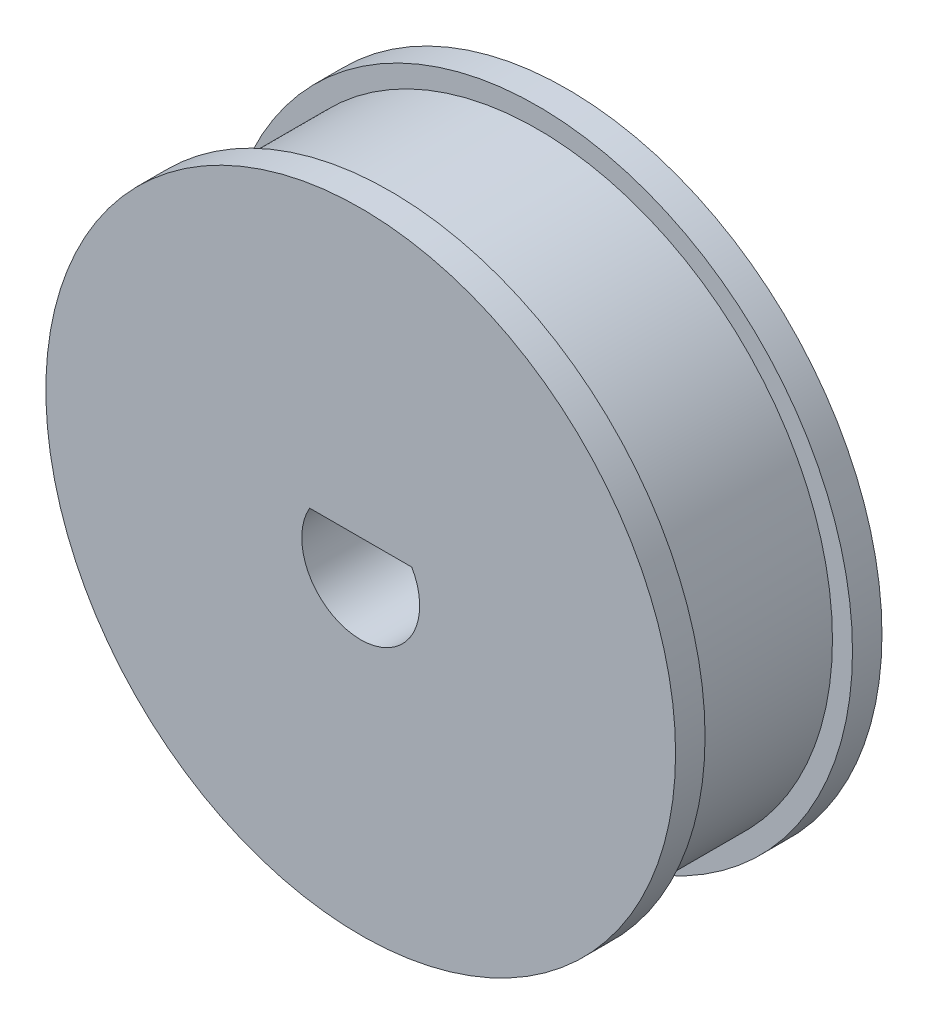
ISO-10303-21;
HEADER;
FILE_DESCRIPTION(('STEP AP214'),'2;1');
FILE_NAME('part.step','',(''),(''),'','','');
FILE_SCHEMA(('AUTOMOTIVE_DESIGN { 1 0 10303 214 1 1 1 1 }'));
ENDSEC;
DATA;
#1=APPLICATION_CONTEXT('core data for automotive mechanical design processes');
#2=APPLICATION_PROTOCOL_DEFINITION('international standard','automotive_design',2000,#1);
#3=PRODUCT_CONTEXT('',#1,'mechanical');
#4=PRODUCT('Part','Part','',(#3));
#5=PRODUCT_RELATED_PRODUCT_CATEGORY('part','',(#4));
#6=PRODUCT_DEFINITION_FORMATION('','',#4);
#7=PRODUCT_DEFINITION_CONTEXT('part definition',#1,'design');
#8=PRODUCT_DEFINITION('design','',#6,#7);
#9=PRODUCT_DEFINITION_SHAPE('','',#8);
#10=(LENGTH_UNIT() NAMED_UNIT(*) SI_UNIT(.MILLI.,.METRE.));
#11=(NAMED_UNIT(*) PLANE_ANGLE_UNIT() SI_UNIT($,.RADIAN.));
#12=(NAMED_UNIT(*) SI_UNIT($,.STERADIAN.) SOLID_ANGLE_UNIT());
#13=UNCERTAINTY_MEASURE_WITH_UNIT(LENGTH_MEASURE(1.E-05),#10,'distance_accuracy_value','');
#14=(GEOMETRIC_REPRESENTATION_CONTEXT(3) GLOBAL_UNCERTAINTY_ASSIGNED_CONTEXT((#13)) GLOBAL_UNIT_ASSIGNED_CONTEXT((#10,
#11,#12)) REPRESENTATION_CONTEXT('',''));
#15=CARTESIAN_POINT('',(0.,0.,0.));
#16=DIRECTION('',(0.,0.,1.));
#17=DIRECTION('',(1.,0.,0.));
#18=AXIS2_PLACEMENT_3D('',#15,#16,#17);
#19=CARTESIAN_POINT('',(0.,0.,7.));
#20=DIRECTION('',(0.,0.,-1.));
#21=DIRECTION('',(-1.,0.,0.));
#22=AXIS2_PLACEMENT_3D('',#19,#20,#21);
#23=CYLINDRICAL_SURFACE('',#22,10.6792057693911);
#24=CARTESIAN_POINT('',(0.,0.,0.));
#25=DIRECTION('',(0.,0.,1.));
#26=DIRECTION('',(1.,0.,0.));
#27=AXIS2_PLACEMENT_3D('',#24,#25,#26);
#28=CIRCLE('',#27,10.6792057693911);
#29=CARTESIAN_POINT('',(10.6792057693911,0.,0.));
#30=VERTEX_POINT('',#29);
#31=EDGE_CURVE('E43',#30,#30,#28,.T.);
#32=ORIENTED_EDGE('',*,*,#31,.T.);
#33=EDGE_LOOP('',(#32));
#34=FACE_BOUND('',#33,.T.);
#35=CARTESIAN_POINT('',(0.,0.,1.));
#36=DIRECTION('',(0.,0.,1.));
#37=DIRECTION('',(1.,0.,0.));
#38=AXIS2_PLACEMENT_3D('',#35,#36,#37);
#39=CIRCLE('',#38,10.6792057693911);
#40=CARTESIAN_POINT('',(10.6792057693911,0.,1.));
#41=VERTEX_POINT('',#40);
#42=EDGE_CURVE('E82',#41,#41,#39,.T.);
#43=ORIENTED_EDGE('',*,*,#42,.F.);
#44=EDGE_LOOP('',(#43));
#45=FACE_BOUND('',#44,.T.);
#46=ADVANCED_FACE('F39',(#34,#45),#23,.T.);
#47=CARTESIAN_POINT('',(0.,0.,7.));
#48=DIRECTION('',(0.,0.,1.));
#49=DIRECTION('',(1.,0.,0.));
#50=AXIS2_PLACEMENT_3D('',#47,#48,#49);
#51=PLANE('',#50);
#52=CARTESIAN_POINT('',(0.,0.,7.));
#53=DIRECTION('',(0.,0.,1.));
#54=DIRECTION('',(1.,0.,0.));
#55=AXIS2_PLACEMENT_3D('',#52,#53,#54);
#56=CIRCLE('',#55,10.6792057693911);
#57=CARTESIAN_POINT('',(10.6792057693911,0.,7.));
#58=VERTEX_POINT('',#57);
#59=EDGE_CURVE('E11',#58,#58,#56,.T.);
#60=ORIENTED_EDGE('',*,*,#59,.T.);
#61=EDGE_LOOP('',(#60));
#62=FACE_BOUND('',#61,.T.);
#63=DIRECTION('',(-1.,0.,0.));
#64=VECTOR('',#63,1.);
#65=CARTESIAN_POINT('',(-1.73205080756888,1.,7.));
#66=LINE('',#65,#64);
#67=CARTESIAN_POINT('',(1.73205080756888,1.,7.));
#68=VERTEX_POINT('',#67);
#69=CARTESIAN_POINT('',(-1.73205080756888,1.,7.));
#70=VERTEX_POINT('',#69);
#71=EDGE_CURVE('E89',#68,#70,#66,.T.);
#72=ORIENTED_EDGE('',*,*,#71,.F.);
#73=CARTESIAN_POINT('',(0.,0.,7.));
#74=DIRECTION('',(0.,0.,1.));
#75=DIRECTION('',(1.,0.,0.));
#76=AXIS2_PLACEMENT_3D('',#73,#74,#75);
#77=CIRCLE('',#76,2.);
#78=EDGE_CURVE('E73',#70,#68,#77,.T.);
#79=ORIENTED_EDGE('',*,*,#78,.F.);
#80=EDGE_LOOP('',(#72,#79));
#81=FACE_BOUND('',#80,.T.);
#82=ADVANCED_FACE('F119',(#62,#81),#51,.T.);
#83=CARTESIAN_POINT('',(0.,0.,0.));
#84=DIRECTION('',(0.,0.,1.));
#85=DIRECTION('',(1.,0.,0.));
#86=AXIS2_PLACEMENT_3D('',#83,#84,#85);
#87=PLANE('',#86);
#88=ORIENTED_EDGE('',*,*,#31,.F.);
#89=EDGE_LOOP('',(#88));
#90=FACE_BOUND('',#89,.T.);
#91=CARTESIAN_POINT('',(0.,0.,0.));
#92=DIRECTION('',(0.,0.,1.));
#93=DIRECTION('',(1.,0.,0.));
#94=AXIS2_PLACEMENT_3D('',#91,#92,#93);
#95=CIRCLE('',#94,2.);
#96=CARTESIAN_POINT('',(-1.73205080756888,1.,0.));
#97=VERTEX_POINT('',#96);
#98=CARTESIAN_POINT('',(1.73205080756888,1.,0.));
#99=VERTEX_POINT('',#98);
#100=EDGE_CURVE('E62',#97,#99,#95,.T.);
#101=ORIENTED_EDGE('',*,*,#100,.T.);
#102=DIRECTION('',(-1.,0.,0.));
#103=VECTOR('',#102,1.);
#104=CARTESIAN_POINT('',(-1.73205080756888,1.,0.));
#105=LINE('',#104,#103);
#106=EDGE_CURVE('E68',#99,#97,#105,.T.);
#107=ORIENTED_EDGE('',*,*,#106,.T.);
#108=EDGE_LOOP('',(#101,#107));
#109=FACE_BOUND('',#108,.T.);
#110=ADVANCED_FACE('F80',(#90,#109),#87,.F.);
#111=CARTESIAN_POINT('',(0.,0.,6.));
#112=DIRECTION('',(0.,0.,1.));
#113=DIRECTION('',(1.,0.,0.));
#114=AXIS2_PLACEMENT_3D('',#111,#112,#113);
#115=CIRCLE('',#114,10.6792057693911);
#116=CARTESIAN_POINT('',(10.6792057693911,0.,6.));
#117=VERTEX_POINT('',#116);
#118=EDGE_CURVE('E86',#117,#117,#115,.T.);
#119=ORIENTED_EDGE('',*,*,#118,.T.);
#120=EDGE_LOOP('',(#119));
#121=FACE_BOUND('',#120,.T.);
#122=ORIENTED_EDGE('',*,*,#59,.F.);
#123=EDGE_LOOP('',(#122));
#124=FACE_BOUND('',#123,.T.);
#125=ADVANCED_FACE('F41',(#121,#124),#23,.T.);
#126=CARTESIAN_POINT('',(0.,0.,7.));
#127=DIRECTION('',(0.,0.,-1.));
#128=DIRECTION('',(-1.,0.,0.));
#129=AXIS2_PLACEMENT_3D('',#126,#127,#128);
#130=CYLINDRICAL_SURFACE('',#129,2.);
#131=ORIENTED_EDGE('',*,*,#100,.F.);
#132=DIRECTION('',(0.,0.,-1.));
#133=VECTOR('',#132,1.);
#134=CARTESIAN_POINT('',(-1.73205080756888,1.,7.));
#135=LINE('',#134,#133);
#136=EDGE_CURVE('E70',#70,#97,#135,.T.);
#137=ORIENTED_EDGE('',*,*,#136,.F.);
#138=ORIENTED_EDGE('',*,*,#78,.T.);
#139=DIRECTION('',(0.,0.,-1.));
#140=VECTOR('',#139,1.);
#141=CARTESIAN_POINT('',(1.73205080756888,1.,7.));
#142=LINE('',#141,#140);
#143=EDGE_CURVE('E55',#68,#99,#142,.T.);
#144=ORIENTED_EDGE('',*,*,#143,.T.);
#145=EDGE_LOOP('',(#131,#137,#138,#144));
#146=FACE_BOUND('',#145,.T.);
#147=ADVANCED_FACE('F75',(#146),#130,.F.);
#148=CARTESIAN_POINT('',(-1.73205080756888,1.,7.));
#149=DIRECTION('',(0.,-1.,0.));
#150=DIRECTION('',(0.,0.,-1.));
#151=AXIS2_PLACEMENT_3D('',#148,#149,#150);
#152=PLANE('',#151);
#153=ORIENTED_EDGE('',*,*,#106,.F.);
#154=ORIENTED_EDGE('',*,*,#143,.F.);
#155=ORIENTED_EDGE('',*,*,#71,.T.);
#156=ORIENTED_EDGE('',*,*,#136,.T.);
#157=EDGE_LOOP('',(#153,#154,#155,#156));
#158=FACE_BOUND('',#157,.T.);
#159=ADVANCED_FACE('F69',(#158),#152,.T.);
#160=CARTESIAN_POINT('',(0.,0.,1.));
#161=DIRECTION('',(0.,0.,1.));
#162=DIRECTION('',(1.,0.,0.));
#163=AXIS2_PLACEMENT_3D('',#160,#161,#162);
#164=PLANE('',#163);
#165=CARTESIAN_POINT('',(0.,0.,1.));
#166=DIRECTION('',(0.,0.,1.));
#167=DIRECTION('',(1.,0.,0.));
#168=AXIS2_PLACEMENT_3D('',#165,#166,#167);
#169=CIRCLE('',#168,10.);
#170=CARTESIAN_POINT('',(10.,0.,1.));
#171=VERTEX_POINT('',#170);
#172=EDGE_CURVE('E98',#171,#171,#169,.T.);
#173=ORIENTED_EDGE('',*,*,#172,.F.);
#174=EDGE_LOOP('',(#173));
#175=FACE_BOUND('',#174,.T.);
#176=ORIENTED_EDGE('',*,*,#42,.T.);
#177=EDGE_LOOP('',(#176));
#178=FACE_BOUND('',#177,.T.);
#179=ADVANCED_FACE('F111',(#175,#178),#164,.T.);
#180=CARTESIAN_POINT('',(0.,0.,6.));
#181=DIRECTION('',(0.,0.,1.));
#182=DIRECTION('',(1.,0.,0.));
#183=AXIS2_PLACEMENT_3D('',#180,#181,#182);
#184=PLANE('',#183);
#185=CARTESIAN_POINT('',(0.,0.,6.));
#186=DIRECTION('',(0.,0.,1.));
#187=DIRECTION('',(1.,0.,0.));
#188=AXIS2_PLACEMENT_3D('',#185,#186,#187);
#189=CIRCLE('',#188,10.);
#190=CARTESIAN_POINT('',(10.,0.,6.));
#191=VERTEX_POINT('',#190);
#192=EDGE_CURVE('E100',#191,#191,#189,.T.);
#193=ORIENTED_EDGE('',*,*,#192,.T.);
#194=EDGE_LOOP('',(#193));
#195=FACE_BOUND('',#194,.T.);
#196=ORIENTED_EDGE('',*,*,#118,.F.);
#197=EDGE_LOOP('',(#196));
#198=FACE_BOUND('',#197,.T.);
#199=ADVANCED_FACE('F114',(#195,#198),#184,.F.);
#200=CARTESIAN_POINT('',(0.,0.,1.));
#201=DIRECTION('',(0.,0.,1.));
#202=DIRECTION('',(1.,0.,0.));
#203=AXIS2_PLACEMENT_3D('',#200,#201,#202);
#204=CYLINDRICAL_SURFACE('',#203,10.);
#205=ORIENTED_EDGE('',*,*,#172,.T.);
#206=EDGE_LOOP('',(#205));
#207=FACE_BOUND('',#206,.T.);
#208=ORIENTED_EDGE('',*,*,#192,.F.);
#209=EDGE_LOOP('',(#208));
#210=FACE_BOUND('',#209,.T.);
#211=ADVANCED_FACE('F108',(#207,#210),#204,.T.);
#212=CLOSED_SHELL('',(#46,#82,#110,#125,#147,#159,#179,#199,#211));
#213=MANIFOLD_SOLID_BREP('B2',#212);
#214=ADVANCED_BREP_SHAPE_REPRESENTATION('',(#18,#213),#14);
#215=SHAPE_DEFINITION_REPRESENTATION(#9,#214);
ENDSEC;
END-ISO-10303-21;
